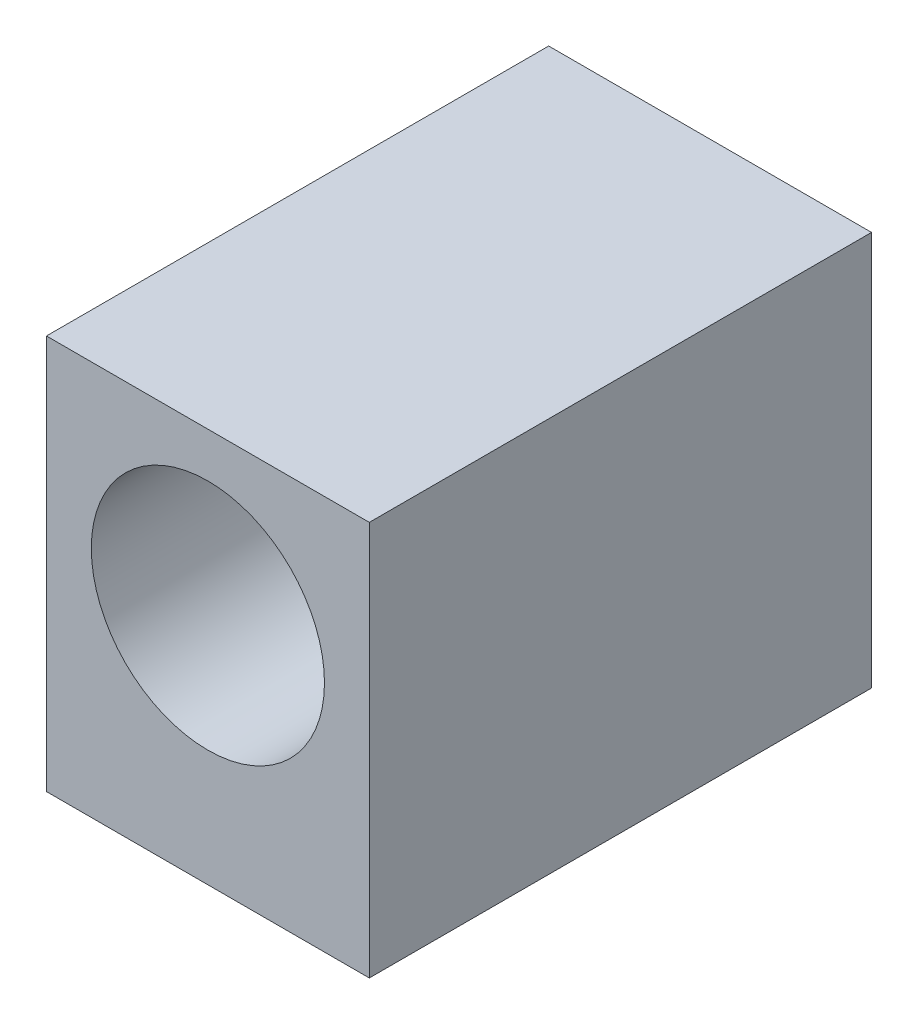
ISO-10303-21;
HEADER;
FILE_DESCRIPTION(('STEP AP214'),'2;1');
FILE_NAME('part.step','',(''),(''),'','','');
FILE_SCHEMA(('AUTOMOTIVE_DESIGN { 1 0 10303 214 1 1 1 1 }'));
ENDSEC;
DATA;
#1=APPLICATION_CONTEXT('core data for automotive mechanical design processes');
#2=APPLICATION_PROTOCOL_DEFINITION('international standard','automotive_design',2000,#1);
#3=PRODUCT_CONTEXT('',#1,'mechanical');
#4=PRODUCT('Part','Part','',(#3));
#5=PRODUCT_RELATED_PRODUCT_CATEGORY('part','',(#4));
#6=PRODUCT_DEFINITION_FORMATION('','',#4);
#7=PRODUCT_DEFINITION_CONTEXT('part definition',#1,'design');
#8=PRODUCT_DEFINITION('design','',#6,#7);
#9=PRODUCT_DEFINITION_SHAPE('','',#8);
#10=(LENGTH_UNIT() NAMED_UNIT(*) SI_UNIT(.MILLI.,.METRE.));
#11=(NAMED_UNIT(*) PLANE_ANGLE_UNIT() SI_UNIT($,.RADIAN.));
#12=(NAMED_UNIT(*) SI_UNIT($,.STERADIAN.) SOLID_ANGLE_UNIT());
#13=UNCERTAINTY_MEASURE_WITH_UNIT(LENGTH_MEASURE(1.E-05),#10,'distance_accuracy_value','');
#14=(GEOMETRIC_REPRESENTATION_CONTEXT(3) GLOBAL_UNCERTAINTY_ASSIGNED_CONTEXT((#13)) GLOBAL_UNIT_ASSIGNED_CONTEXT((#10,
#11,#12)) REPRESENTATION_CONTEXT('',''));
#15=CARTESIAN_POINT('',(0.,0.,0.));
#16=DIRECTION('',(0.,0.,1.));
#17=DIRECTION('',(1.,0.,0.));
#18=AXIS2_PLACEMENT_3D('',#15,#16,#17);
#19=CARTESIAN_POINT('',(0.,11.,0.));
#20=DIRECTION('',(1.,0.,0.));
#21=DIRECTION('',(0.,0.,-1.));
#22=AXIS2_PLACEMENT_3D('',#19,#20,#21);
#23=PLANE('',#22);
#24=DIRECTION('',(0.,0.,1.));
#25=VECTOR('',#24,1.);
#26=CARTESIAN_POINT('',(0.,0.,0.));
#27=LINE('',#26,#25);
#28=CARTESIAN_POINT('',(0.,0.,-14.));
#29=VERTEX_POINT('',#28);
#30=CARTESIAN_POINT('',(0.,0.,0.));
#31=VERTEX_POINT('',#30);
#32=EDGE_CURVE('E96',#29,#31,#27,.T.);
#33=ORIENTED_EDGE('',*,*,#32,.T.);
#34=DIRECTION('',(0.,-1.,0.));
#35=VECTOR('',#34,1.);
#36=CARTESIAN_POINT('',(0.,11.,0.));
#37=LINE('',#36,#35);
#38=CARTESIAN_POINT('',(0.,11.,0.));
#39=VERTEX_POINT('',#38);
#40=EDGE_CURVE('E11',#39,#31,#37,.T.);
#41=ORIENTED_EDGE('',*,*,#40,.F.);
#42=DIRECTION('',(0.,0.,1.));
#43=VECTOR('',#42,1.);
#44=CARTESIAN_POINT('',(0.,11.,0.));
#45=LINE('',#44,#43);
#46=CARTESIAN_POINT('',(0.,11.,-14.));
#47=VERTEX_POINT('',#46);
#48=EDGE_CURVE('E84',#47,#39,#45,.T.);
#49=ORIENTED_EDGE('',*,*,#48,.F.);
#50=DIRECTION('',(0.,-1.,0.));
#51=VECTOR('',#50,1.);
#52=CARTESIAN_POINT('',(0.,11.,-14.));
#53=LINE('',#52,#51);
#54=EDGE_CURVE('E92',#47,#29,#53,.T.);
#55=ORIENTED_EDGE('',*,*,#54,.T.);
#56=EDGE_LOOP('',(#33,#41,#49,#55));
#57=FACE_BOUND('',#56,.T.);
#58=ADVANCED_FACE('F33',(#57),#23,.F.);
#59=CARTESIAN_POINT('',(0.,11.,0.));
#60=DIRECTION('',(0.,0.,-1.));
#61=DIRECTION('',(-1.,0.,0.));
#62=AXIS2_PLACEMENT_3D('',#59,#60,#61);
#63=PLANE('',#62);
#64=CARTESIAN_POINT('',(4.5,6.5,0.));
#65=DIRECTION('',(0.,0.,1.));
#66=DIRECTION('',(1.,0.,0.));
#67=AXIS2_PLACEMENT_3D('',#64,#65,#66);
#68=CIRCLE('',#67,3.25);
#69=CARTESIAN_POINT('',(7.75,6.5,0.));
#70=VERTEX_POINT('',#69);
#71=EDGE_CURVE('E110',#70,#70,#68,.T.);
#72=ORIENTED_EDGE('',*,*,#71,.F.);
#73=EDGE_LOOP('',(#72));
#74=FACE_BOUND('',#73,.T.);
#75=DIRECTION('',(1.,0.,0.));
#76=VECTOR('',#75,1.);
#77=CARTESIAN_POINT('',(0.,0.,0.));
#78=LINE('',#77,#76);
#79=CARTESIAN_POINT('',(9.00000000000001,0.,0.));
#80=VERTEX_POINT('',#79);
#81=EDGE_CURVE('E88',#31,#80,#78,.T.);
#82=ORIENTED_EDGE('',*,*,#81,.T.);
#83=DIRECTION('',(0.,-1.,0.));
#84=VECTOR('',#83,1.);
#85=CARTESIAN_POINT('',(9.00000000000001,11.,0.));
#86=LINE('',#85,#84);
#87=CARTESIAN_POINT('',(9.00000000000001,11.,0.));
#88=VERTEX_POINT('',#87);
#89=EDGE_CURVE('E41',#88,#80,#86,.T.);
#90=ORIENTED_EDGE('',*,*,#89,.F.);
#91=DIRECTION('',(1.,0.,0.));
#92=VECTOR('',#91,1.);
#93=CARTESIAN_POINT('',(0.,11.,0.));
#94=LINE('',#93,#92);
#95=EDGE_CURVE('E79',#39,#88,#94,.T.);
#96=ORIENTED_EDGE('',*,*,#95,.F.);
#97=ORIENTED_EDGE('',*,*,#40,.T.);
#98=EDGE_LOOP('',(#82,#90,#96,#97));
#99=FACE_BOUND('',#98,.T.);
#100=ADVANCED_FACE('F87',(#74,#99),#63,.F.);
#101=CARTESIAN_POINT('',(9.00000000000001,11.,0.));
#102=DIRECTION('',(-1.,0.,0.));
#103=DIRECTION('',(0.,0.,1.));
#104=AXIS2_PLACEMENT_3D('',#101,#102,#103);
#105=PLANE('',#104);
#106=DIRECTION('',(0.,0.,-1.));
#107=VECTOR('',#106,1.);
#108=CARTESIAN_POINT('',(9.00000000000001,0.,0.));
#109=LINE('',#108,#107);
#110=CARTESIAN_POINT('',(9.00000000000001,0.,-14.));
#111=VERTEX_POINT('',#110);
#112=EDGE_CURVE('E66',#80,#111,#109,.T.);
#113=ORIENTED_EDGE('',*,*,#112,.T.);
#114=DIRECTION('',(0.,-1.,0.));
#115=VECTOR('',#114,1.);
#116=CARTESIAN_POINT('',(9.00000000000001,11.,-14.));
#117=LINE('',#116,#115);
#118=CARTESIAN_POINT('',(9.00000000000001,11.,-14.));
#119=VERTEX_POINT('',#118);
#120=EDGE_CURVE('E89',#119,#111,#117,.T.);
#121=ORIENTED_EDGE('',*,*,#120,.F.);
#122=DIRECTION('',(0.,0.,-1.));
#123=VECTOR('',#122,1.);
#124=CARTESIAN_POINT('',(9.00000000000001,11.,0.));
#125=LINE('',#124,#123);
#126=EDGE_CURVE('E82',#88,#119,#125,.T.);
#127=ORIENTED_EDGE('',*,*,#126,.F.);
#128=ORIENTED_EDGE('',*,*,#89,.T.);
#129=EDGE_LOOP('',(#113,#121,#127,#128));
#130=FACE_BOUND('',#129,.T.);
#131=ADVANCED_FACE('F90',(#130),#105,.F.);
#132=CARTESIAN_POINT('',(0.,11.,-14.));
#133=DIRECTION('',(0.,0.,1.));
#134=DIRECTION('',(1.,0.,0.));
#135=AXIS2_PLACEMENT_3D('',#132,#133,#134);
#136=PLANE('',#135);
#137=DIRECTION('',(-1.,0.,0.));
#138=VECTOR('',#137,1.);
#139=CARTESIAN_POINT('',(0.,0.,-14.));
#140=LINE('',#139,#138);
#141=EDGE_CURVE('E72',#111,#29,#140,.T.);
#142=ORIENTED_EDGE('',*,*,#141,.T.);
#143=ORIENTED_EDGE('',*,*,#54,.F.);
#144=DIRECTION('',(-1.,0.,0.));
#145=VECTOR('',#144,1.);
#146=CARTESIAN_POINT('',(0.,11.,-14.));
#147=LINE('',#146,#145);
#148=EDGE_CURVE('E49',#119,#47,#147,.T.);
#149=ORIENTED_EDGE('',*,*,#148,.F.);
#150=ORIENTED_EDGE('',*,*,#120,.T.);
#151=EDGE_LOOP('',(#142,#143,#149,#150));
#152=FACE_BOUND('',#151,.T.);
#153=ADVANCED_FACE('F104',(#152),#136,.F.);
#154=CARTESIAN_POINT('',(0.,11.,0.));
#155=DIRECTION('',(0.,-1.,0.));
#156=DIRECTION('',(0.,0.,-1.));
#157=AXIS2_PLACEMENT_3D('',#154,#155,#156);
#158=PLANE('',#157);
#159=ORIENTED_EDGE('',*,*,#48,.T.);
#160=ORIENTED_EDGE('',*,*,#95,.T.);
#161=ORIENTED_EDGE('',*,*,#126,.T.);
#162=ORIENTED_EDGE('',*,*,#148,.T.);
#163=EDGE_LOOP('',(#159,#160,#161,#162));
#164=FACE_BOUND('',#163,.T.);
#165=ADVANCED_FACE('F80',(#164),#158,.F.);
#166=CARTESIAN_POINT('',(0.,0.,0.));
#167=DIRECTION('',(0.,-1.,0.));
#168=DIRECTION('',(0.,0.,-1.));
#169=AXIS2_PLACEMENT_3D('',#166,#167,#168);
#170=PLANE('',#169);
#171=ORIENTED_EDGE('',*,*,#32,.F.);
#172=ORIENTED_EDGE('',*,*,#141,.F.);
#173=ORIENTED_EDGE('',*,*,#112,.F.);
#174=ORIENTED_EDGE('',*,*,#81,.F.);
#175=EDGE_LOOP('',(#171,#172,#173,#174));
#176=FACE_BOUND('',#175,.T.);
#177=ADVANCED_FACE('F107',(#176),#170,.T.);
#178=CARTESIAN_POINT('',(4.5,6.5,-9.));
#179=DIRECTION('',(0.,0.,1.));
#180=DIRECTION('',(1.,0.,0.));
#181=AXIS2_PLACEMENT_3D('',#178,#179,#180);
#182=CYLINDRICAL_SURFACE('',#181,3.25);
#183=CARTESIAN_POINT('',(4.5,6.5,-9.));
#184=DIRECTION('',(0.,0.,1.));
#185=DIRECTION('',(1.,0.,0.));
#186=AXIS2_PLACEMENT_3D('',#183,#184,#185);
#187=CIRCLE('',#186,3.25);
#188=CARTESIAN_POINT('',(7.75,6.5,-9.));
#189=VERTEX_POINT('',#188);
#190=EDGE_CURVE('E99',#189,#189,#187,.T.);
#191=ORIENTED_EDGE('',*,*,#190,.F.);
#192=EDGE_LOOP('',(#191));
#193=FACE_BOUND('',#192,.T.);
#194=ORIENTED_EDGE('',*,*,#71,.T.);
#195=EDGE_LOOP('',(#194));
#196=FACE_BOUND('',#195,.T.);
#197=ADVANCED_FACE('F118',(#193,#196),#182,.F.);
#198=CARTESIAN_POINT('',(4.5,6.5,-9.));
#199=DIRECTION('',(0.,0.,1.));
#200=DIRECTION('',(1.,0.,0.));
#201=AXIS2_PLACEMENT_3D('',#198,#199,#200);
#202=PLANE('',#201);
#203=ORIENTED_EDGE('',*,*,#190,.T.);
#204=EDGE_LOOP('',(#203));
#205=FACE_BOUND('',#204,.T.);
#206=ADVANCED_FACE('F116',(#205),#202,.T.);
#207=CLOSED_SHELL('',(#58,#100,#131,#153,#165,#177,#197,#206));
#208=MANIFOLD_SOLID_BREP('B2',#207);
#209=ADVANCED_BREP_SHAPE_REPRESENTATION('',(#18,#208),#14);
#210=SHAPE_DEFINITION_REPRESENTATION(#9,#209);
ENDSEC;
END-ISO-10303-21;
